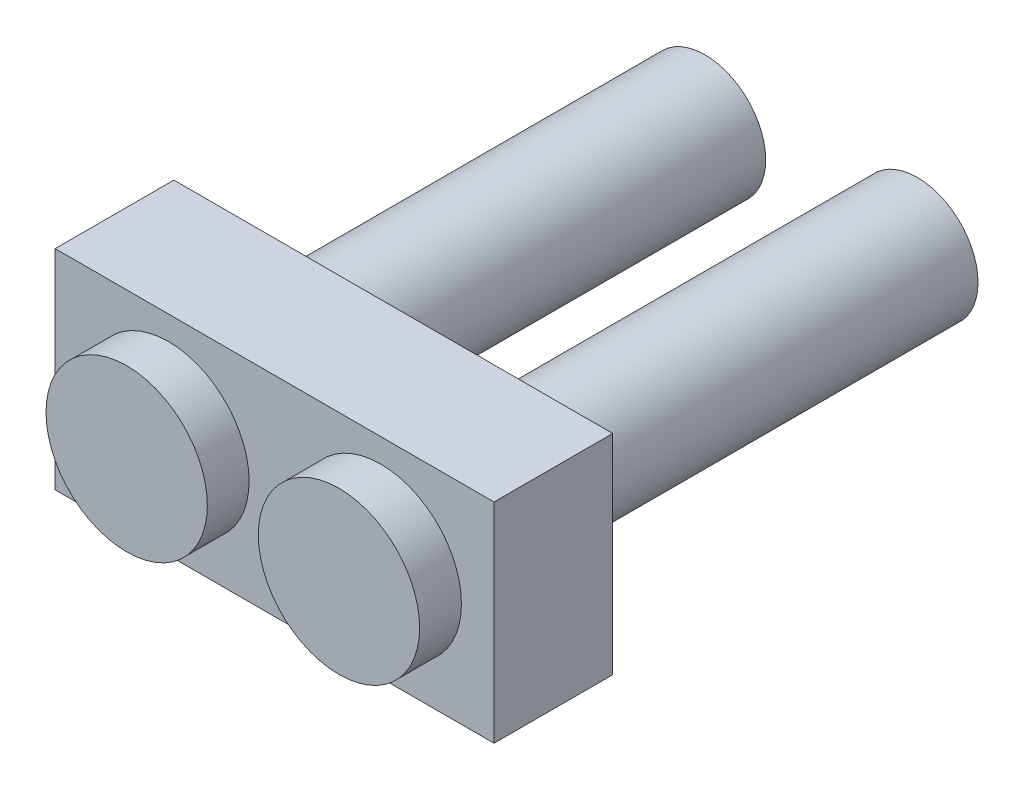
ISO-10303-21;
HEADER;
FILE_DESCRIPTION(('STEP AP214'),'2;1');
FILE_NAME('part.step','',(''),(''),'','','');
FILE_SCHEMA(('AUTOMOTIVE_DESIGN { 1 0 10303 214 1 1 1 1 }'));
ENDSEC;
DATA;
#1=APPLICATION_CONTEXT('core data for automotive mechanical design processes');
#2=APPLICATION_PROTOCOL_DEFINITION('international standard','automotive_design',2000,#1);
#3=PRODUCT_CONTEXT('',#1,'mechanical');
#4=PRODUCT('Part','Part','',(#3));
#5=PRODUCT_RELATED_PRODUCT_CATEGORY('part','',(#4));
#6=PRODUCT_DEFINITION_FORMATION('','',#4);
#7=PRODUCT_DEFINITION_CONTEXT('part definition',#1,'design');
#8=PRODUCT_DEFINITION('design','',#6,#7);
#9=PRODUCT_DEFINITION_SHAPE('','',#8);
#10=(LENGTH_UNIT() NAMED_UNIT(*) SI_UNIT(.MILLI.,.METRE.));
#11=(NAMED_UNIT(*) PLANE_ANGLE_UNIT() SI_UNIT($,.RADIAN.));
#12=(NAMED_UNIT(*) SI_UNIT($,.STERADIAN.) SOLID_ANGLE_UNIT());
#13=UNCERTAINTY_MEASURE_WITH_UNIT(LENGTH_MEASURE(1.E-05),#10,'distance_accuracy_value','');
#14=(GEOMETRIC_REPRESENTATION_CONTEXT(3) GLOBAL_UNCERTAINTY_ASSIGNED_CONTEXT((#13)) GLOBAL_UNIT_ASSIGNED_CONTEXT((#10,
#11,#12)) REPRESENTATION_CONTEXT('',''));
#15=CARTESIAN_POINT('',(0.,0.,0.));
#16=DIRECTION('',(0.,0.,1.));
#17=DIRECTION('',(1.,0.,0.));
#18=AXIS2_PLACEMENT_3D('',#15,#16,#17);
#19=CARTESIAN_POINT('',(-2.625,-1.25,1.42));
#20=DIRECTION('',(1.,0.,0.));
#21=DIRECTION('',(0.,0.,-1.));
#22=AXIS2_PLACEMENT_3D('',#19,#20,#21);
#23=PLANE('',#22);
#24=DIRECTION('',(0.,-1.,0.));
#25=VECTOR('',#24,1.);
#26=CARTESIAN_POINT('',(-2.625,-1.25,0.));
#27=LINE('',#26,#25);
#28=CARTESIAN_POINT('',(-2.625,1.25,0.));
#29=VERTEX_POINT('',#28);
#30=CARTESIAN_POINT('',(-2.625,-1.25,0.));
#31=VERTEX_POINT('',#30);
#32=EDGE_CURVE('E102',#29,#31,#27,.T.);
#33=ORIENTED_EDGE('',*,*,#32,.T.);
#34=DIRECTION('',(0.,0.,-1.));
#35=VECTOR('',#34,1.);
#36=CARTESIAN_POINT('',(-2.625,-1.25,1.42));
#37=LINE('',#36,#35);
#38=CARTESIAN_POINT('',(-2.625,-1.25,1.42));
#39=VERTEX_POINT('',#38);
#40=EDGE_CURVE('E93',#39,#31,#37,.T.);
#41=ORIENTED_EDGE('',*,*,#40,.F.);
#42=DIRECTION('',(0.,-1.,0.));
#43=VECTOR('',#42,1.);
#44=CARTESIAN_POINT('',(-2.625,-1.25,1.42));
#45=LINE('',#44,#43);
#46=CARTESIAN_POINT('',(-2.625,1.25,1.42));
#47=VERTEX_POINT('',#46);
#48=EDGE_CURVE('E87',#47,#39,#45,.T.);
#49=ORIENTED_EDGE('',*,*,#48,.F.);
#50=DIRECTION('',(0.,0.,-1.));
#51=VECTOR('',#50,1.);
#52=CARTESIAN_POINT('',(-2.625,1.25,1.42));
#53=LINE('',#52,#51);
#54=EDGE_CURVE('E98',#47,#29,#53,.T.);
#55=ORIENTED_EDGE('',*,*,#54,.T.);
#56=EDGE_LOOP('',(#33,#41,#49,#55));
#57=FACE_BOUND('',#56,.T.);
#58=ADVANCED_FACE('F35',(#57),#23,.F.);
#59=CARTESIAN_POINT('',(2.625,-1.25,1.42));
#60=DIRECTION('',(0.,1.,0.));
#61=DIRECTION('',(-1.,0.,0.));
#62=AXIS2_PLACEMENT_3D('',#59,#60,#61);
#63=PLANE('',#62);
#64=DIRECTION('',(1.,0.,0.));
#65=VECTOR('',#64,1.);
#66=CARTESIAN_POINT('',(2.625,-1.25,0.));
#67=LINE('',#66,#65);
#68=CARTESIAN_POINT('',(2.625,-1.25,0.));
#69=VERTEX_POINT('',#68);
#70=EDGE_CURVE('E92',#31,#69,#67,.T.);
#71=ORIENTED_EDGE('',*,*,#70,.T.);
#72=DIRECTION('',(0.,0.,-1.));
#73=VECTOR('',#72,1.);
#74=CARTESIAN_POINT('',(2.625,-1.25,1.42));
#75=LINE('',#74,#73);
#76=CARTESIAN_POINT('',(2.625,-1.25,1.42));
#77=VERTEX_POINT('',#76);
#78=EDGE_CURVE('E90',#77,#69,#75,.T.);
#79=ORIENTED_EDGE('',*,*,#78,.F.);
#80=DIRECTION('',(1.,0.,0.));
#81=VECTOR('',#80,1.);
#82=CARTESIAN_POINT('',(2.625,-1.25,1.42));
#83=LINE('',#82,#81);
#84=EDGE_CURVE('E82',#39,#77,#83,.T.);
#85=ORIENTED_EDGE('',*,*,#84,.F.);
#86=ORIENTED_EDGE('',*,*,#40,.T.);
#87=EDGE_LOOP('',(#71,#79,#85,#86));
#88=FACE_BOUND('',#87,.T.);
#89=ADVANCED_FACE('F91',(#88),#63,.F.);
#90=CARTESIAN_POINT('',(2.625,-1.25,1.42));
#91=DIRECTION('',(-1.,0.,0.));
#92=DIRECTION('',(0.,0.,1.));
#93=AXIS2_PLACEMENT_3D('',#90,#91,#92);
#94=PLANE('',#93);
#95=DIRECTION('',(0.,1.,0.));
#96=VECTOR('',#95,1.);
#97=CARTESIAN_POINT('',(2.625,-1.25,0.));
#98=LINE('',#97,#96);
#99=CARTESIAN_POINT('',(2.625,1.25,0.));
#100=VERTEX_POINT('',#99);
#101=EDGE_CURVE('E68',#69,#100,#98,.T.);
#102=ORIENTED_EDGE('',*,*,#101,.T.);
#103=DIRECTION('',(0.,0.,-1.));
#104=VECTOR('',#103,1.);
#105=CARTESIAN_POINT('',(2.625,1.25,1.42));
#106=LINE('',#105,#104);
#107=CARTESIAN_POINT('',(2.625,1.25,1.42));
#108=VERTEX_POINT('',#107);
#109=EDGE_CURVE('E94',#108,#100,#106,.T.);
#110=ORIENTED_EDGE('',*,*,#109,.F.);
#111=DIRECTION('',(0.,1.,0.));
#112=VECTOR('',#111,1.);
#113=CARTESIAN_POINT('',(2.625,-1.25,1.42));
#114=LINE('',#113,#112);
#115=EDGE_CURVE('E85',#77,#108,#114,.T.);
#116=ORIENTED_EDGE('',*,*,#115,.F.);
#117=ORIENTED_EDGE('',*,*,#78,.T.);
#118=EDGE_LOOP('',(#102,#110,#116,#117));
#119=FACE_BOUND('',#118,.T.);
#120=ADVANCED_FACE('F96',(#119),#94,.F.);
#121=CARTESIAN_POINT('',(2.625,1.25,1.42));
#122=DIRECTION('',(0.,-1.,0.));
#123=DIRECTION('',(1.,0.,0.));
#124=AXIS2_PLACEMENT_3D('',#121,#122,#123);
#125=PLANE('',#124);
#126=DIRECTION('',(-1.,0.,0.));
#127=VECTOR('',#126,1.);
#128=CARTESIAN_POINT('',(2.625,1.25,0.));
#129=LINE('',#128,#127);
#130=EDGE_CURVE('E74',#100,#29,#129,.T.);
#131=ORIENTED_EDGE('',*,*,#130,.T.);
#132=ORIENTED_EDGE('',*,*,#54,.F.);
#133=DIRECTION('',(-1.,0.,0.));
#134=VECTOR('',#133,1.);
#135=CARTESIAN_POINT('',(2.625,1.25,1.42));
#136=LINE('',#135,#134);
#137=EDGE_CURVE('E51',#108,#47,#136,.T.);
#138=ORIENTED_EDGE('',*,*,#137,.F.);
#139=ORIENTED_EDGE('',*,*,#109,.T.);
#140=EDGE_LOOP('',(#131,#132,#138,#139));
#141=FACE_BOUND('',#140,.T.);
#142=ADVANCED_FACE('F123',(#141),#125,.F.);
#143=CARTESIAN_POINT('',(0.,0.,1.42));
#144=DIRECTION('',(0.,0.,1.));
#145=DIRECTION('',(1.,0.,0.));
#146=AXIS2_PLACEMENT_3D('',#143,#144,#145);
#147=PLANE('',#146);
#148=CARTESIAN_POINT('',(1.27,0.,1.42));
#149=DIRECTION('',(0.,0.,1.));
#150=DIRECTION('',(1.,0.,0.));
#151=AXIS2_PLACEMENT_3D('',#148,#149,#150);
#152=CIRCLE('',#151,0.965);
#153=CARTESIAN_POINT('',(2.235,0.,1.42));
#154=VERTEX_POINT('',#153);
#155=EDGE_CURVE('E246',#154,#154,#152,.T.);
#156=ORIENTED_EDGE('',*,*,#155,.F.);
#157=EDGE_LOOP('',(#156));
#158=FACE_BOUND('',#157,.T.);
#159=CARTESIAN_POINT('',(-1.27,0.,1.42));
#160=DIRECTION('',(0.,0.,1.));
#161=DIRECTION('',(1.,0.,0.));
#162=AXIS2_PLACEMENT_3D('',#159,#160,#161);
#163=CIRCLE('',#162,0.965);
#164=CARTESIAN_POINT('',(-0.305,0.,1.42));
#165=VERTEX_POINT('',#164);
#166=EDGE_CURVE('E245',#165,#165,#163,.T.);
#167=ORIENTED_EDGE('',*,*,#166,.F.);
#168=EDGE_LOOP('',(#167));
#169=FACE_BOUND('',#168,.T.);
#170=ORIENTED_EDGE('',*,*,#48,.T.);
#171=ORIENTED_EDGE('',*,*,#84,.T.);
#172=ORIENTED_EDGE('',*,*,#115,.T.);
#173=ORIENTED_EDGE('',*,*,#137,.T.);
#174=EDGE_LOOP('',(#170,#171,#172,#173));
#175=FACE_BOUND('',#174,.T.);
#176=ADVANCED_FACE('F83',(#158,#169,#175),#147,.T.);
#177=CARTESIAN_POINT('',(0.,0.,0.));
#178=DIRECTION('',(0.,0.,1.));
#179=DIRECTION('',(1.,0.,0.));
#180=AXIS2_PLACEMENT_3D('',#177,#178,#179);
#181=PLANE('',#180);
#182=CARTESIAN_POINT('',(-1.27,0.,0.));
#183=DIRECTION('',(0.,0.,1.));
#184=DIRECTION('',(1.,0.,0.));
#185=AXIS2_PLACEMENT_3D('',#182,#183,#184);
#186=CIRCLE('',#185,0.725);
#187=CARTESIAN_POINT('',(-0.545,0.,0.));
#188=VERTEX_POINT('',#187);
#189=EDGE_CURVE('E11',#188,#188,#186,.F.);
#190=ORIENTED_EDGE('',*,*,#189,.F.);
#191=EDGE_LOOP('',(#190));
#192=FACE_BOUND('',#191,.T.);
#193=CARTESIAN_POINT('',(1.27,0.,0.));
#194=DIRECTION('',(0.,0.,1.));
#195=DIRECTION('',(1.,0.,0.));
#196=AXIS2_PLACEMENT_3D('',#193,#194,#195);
#197=CIRCLE('',#196,0.725);
#198=CARTESIAN_POINT('',(1.995,0.,0.));
#199=VERTEX_POINT('',#198);
#200=EDGE_CURVE('E43',#199,#199,#197,.F.);
#201=ORIENTED_EDGE('',*,*,#200,.F.);
#202=EDGE_LOOP('',(#201));
#203=FACE_BOUND('',#202,.T.);
#204=ORIENTED_EDGE('',*,*,#32,.F.);
#205=ORIENTED_EDGE('',*,*,#130,.F.);
#206=ORIENTED_EDGE('',*,*,#101,.F.);
#207=ORIENTED_EDGE('',*,*,#70,.F.);
#208=EDGE_LOOP('',(#204,#205,#206,#207));
#209=FACE_BOUND('',#208,.T.);
#210=ADVANCED_FACE('F116',(#192,#203,#209),#181,.F.);
#211=CARTESIAN_POINT('',(1.27,0.,-5.));
#212=DIRECTION('',(0.,0.,1.));
#213=DIRECTION('',(1.,0.,0.));
#214=AXIS2_PLACEMENT_3D('',#211,#212,#213);
#215=CYLINDRICAL_SURFACE('',#214,0.725);
#216=CARTESIAN_POINT('',(1.27,0.,-5.));
#217=DIRECTION('',(0.,0.,-1.));
#218=DIRECTION('',(-1.,0.,0.));
#219=AXIS2_PLACEMENT_3D('',#216,#217,#218);
#220=CIRCLE('',#219,0.725);
#221=CARTESIAN_POINT('',(0.545,0.,-5.));
#222=VERTEX_POINT('',#221);
#223=EDGE_CURVE('E105',#222,#222,#220,.T.);
#224=ORIENTED_EDGE('',*,*,#223,.F.);
#225=EDGE_LOOP('',(#224));
#226=FACE_BOUND('',#225,.T.);
#227=ORIENTED_EDGE('',*,*,#200,.T.);
#228=EDGE_LOOP('',(#227));
#229=FACE_BOUND('',#228,.T.);
#230=ADVANCED_FACE('F114',(#226,#229),#215,.T.);
#231=CARTESIAN_POINT('',(1.27,0.,-5.));
#232=DIRECTION('',(0.,0.,-1.));
#233=DIRECTION('',(-1.,0.,0.));
#234=AXIS2_PLACEMENT_3D('',#231,#232,#233);
#235=PLANE('',#234);
#236=ORIENTED_EDGE('',*,*,#223,.T.);
#237=EDGE_LOOP('',(#236));
#238=FACE_BOUND('',#237,.T.);
#239=ADVANCED_FACE('F163',(#238),#235,.T.);
#240=CARTESIAN_POINT('',(-1.27,0.,-5.));
#241=DIRECTION('',(0.,0.,1.));
#242=DIRECTION('',(1.,0.,0.));
#243=AXIS2_PLACEMENT_3D('',#240,#241,#242);
#244=CYLINDRICAL_SURFACE('',#243,0.725);
#245=CARTESIAN_POINT('',(-1.27,0.,-5.));
#246=DIRECTION('',(0.,0.,-1.));
#247=DIRECTION('',(1.,0.,0.));
#248=AXIS2_PLACEMENT_3D('',#245,#246,#247);
#249=CIRCLE('',#248,0.725);
#250=CARTESIAN_POINT('',(-0.545,0.,-5.));
#251=VERTEX_POINT('',#250);
#252=EDGE_CURVE('E255',#251,#251,#249,.T.);
#253=ORIENTED_EDGE('',*,*,#252,.F.);
#254=EDGE_LOOP('',(#253));
#255=FACE_BOUND('',#254,.T.);
#256=ORIENTED_EDGE('',*,*,#189,.T.);
#257=EDGE_LOOP('',(#256));
#258=FACE_BOUND('',#257,.T.);
#259=ADVANCED_FACE('F173',(#255,#258),#244,.T.);
#260=CARTESIAN_POINT('',(-1.27,0.,-5.));
#261=DIRECTION('',(0.,0.,1.));
#262=DIRECTION('',(1.,0.,0.));
#263=AXIS2_PLACEMENT_3D('',#260,#261,#262);
#264=PLANE('',#263);
#265=ORIENTED_EDGE('',*,*,#252,.T.);
#266=EDGE_LOOP('',(#265));
#267=FACE_BOUND('',#266,.T.);
#268=ADVANCED_FACE('F183',(#267),#264,.F.);
#269=CARTESIAN_POINT('',(-1.27,0.,1.92));
#270=DIRECTION('',(0.,0.,-1.));
#271=DIRECTION('',(-1.,0.,0.));
#272=AXIS2_PLACEMENT_3D('',#269,#270,#271);
#273=CYLINDRICAL_SURFACE('',#272,0.965);
#274=CARTESIAN_POINT('',(-1.27,0.,1.92));
#275=DIRECTION('',(0.,0.,1.));
#276=DIRECTION('',(1.,0.,0.));
#277=AXIS2_PLACEMENT_3D('',#274,#275,#276);
#278=CIRCLE('',#277,0.965);
#279=CARTESIAN_POINT('',(-0.305,0.,1.92));
#280=VERTEX_POINT('',#279);
#281=EDGE_CURVE('E249',#280,#280,#278,.T.);
#282=ORIENTED_EDGE('',*,*,#281,.F.);
#283=EDGE_LOOP('',(#282));
#284=FACE_BOUND('',#283,.T.);
#285=ORIENTED_EDGE('',*,*,#166,.T.);
#286=EDGE_LOOP('',(#285));
#287=FACE_BOUND('',#286,.T.);
#288=ADVANCED_FACE('F193',(#284,#287),#273,.T.);
#289=CARTESIAN_POINT('',(-1.27,0.,1.92));
#290=DIRECTION('',(0.,0.,1.));
#291=DIRECTION('',(1.,0.,0.));
#292=AXIS2_PLACEMENT_3D('',#289,#290,#291);
#293=PLANE('',#292);
#294=ORIENTED_EDGE('',*,*,#281,.T.);
#295=EDGE_LOOP('',(#294));
#296=FACE_BOUND('',#295,.T.);
#297=ADVANCED_FACE('F208',(#296),#293,.T.);
#298=CARTESIAN_POINT('',(1.27,0.,1.92));
#299=DIRECTION('',(0.,0.,-1.));
#300=DIRECTION('',(-1.,0.,0.));
#301=AXIS2_PLACEMENT_3D('',#298,#299,#300);
#302=CYLINDRICAL_SURFACE('',#301,0.965);
#303=CARTESIAN_POINT('',(1.27,0.,1.92));
#304=DIRECTION('',(0.,0.,1.));
#305=DIRECTION('',(1.,0.,0.));
#306=AXIS2_PLACEMENT_3D('',#303,#304,#305);
#307=CIRCLE('',#306,0.965);
#308=CARTESIAN_POINT('',(2.235,0.,1.92));
#309=VERTEX_POINT('',#308);
#310=EDGE_CURVE('E244',#309,#309,#307,.T.);
#311=ORIENTED_EDGE('',*,*,#310,.F.);
#312=EDGE_LOOP('',(#311));
#313=FACE_BOUND('',#312,.T.);
#314=ORIENTED_EDGE('',*,*,#155,.T.);
#315=EDGE_LOOP('',(#314));
#316=FACE_BOUND('',#315,.T.);
#317=ADVANCED_FACE('F218',(#313,#316),#302,.T.);
#318=CARTESIAN_POINT('',(1.27,0.,1.92));
#319=DIRECTION('',(0.,0.,1.));
#320=DIRECTION('',(1.,0.,0.));
#321=AXIS2_PLACEMENT_3D('',#318,#319,#320);
#322=PLANE('',#321);
#323=ORIENTED_EDGE('',*,*,#310,.T.);
#324=EDGE_LOOP('',(#323));
#325=FACE_BOUND('',#324,.T.);
#326=ADVANCED_FACE('F228',(#325),#322,.T.);
#327=CLOSED_SHELL('',(#58,#89,#120,#142,#176,#210,#230,#239,#259,#268,#288,#297,#317,#326));
#328=MANIFOLD_SOLID_BREP('B2',#327);
#329=ADVANCED_BREP_SHAPE_REPRESENTATION('',(#18,#328),#14);
#330=SHAPE_DEFINITION_REPRESENTATION(#9,#329);
ENDSEC;
END-ISO-10303-21;
